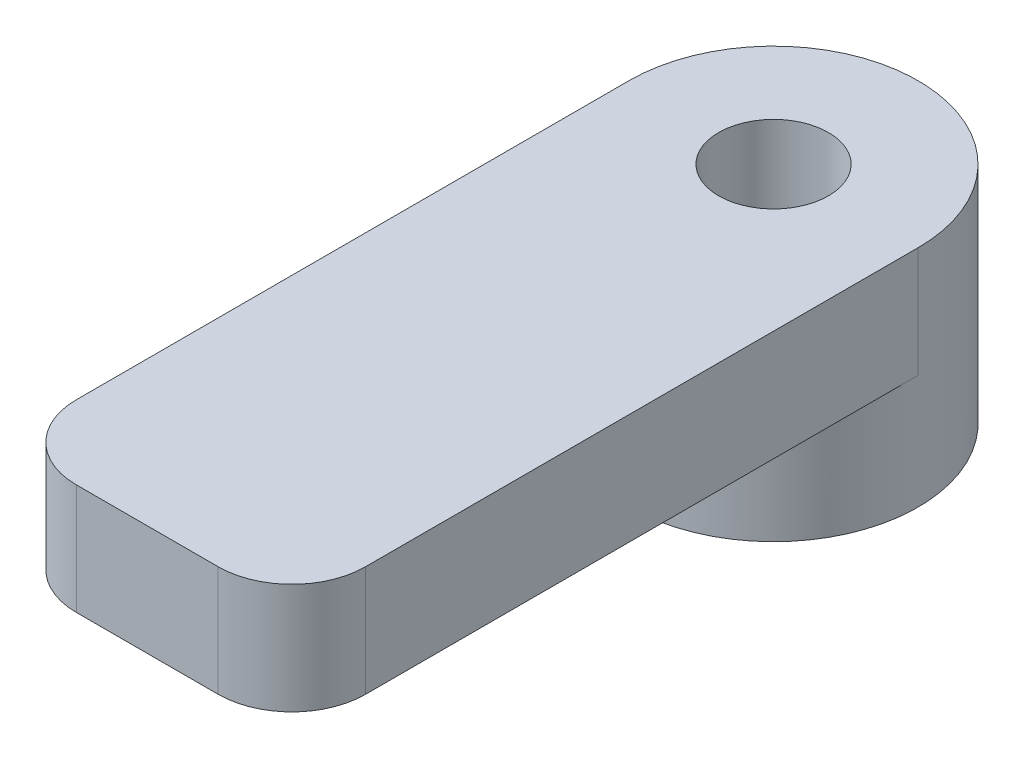
ISO-10303-21;
HEADER;
FILE_DESCRIPTION(('STEP AP214'),'2;1');
FILE_NAME('part.step','',(''),(''),'','','');
FILE_SCHEMA(('AUTOMOTIVE_DESIGN { 1 0 10303 214 1 1 1 1 }'));
ENDSEC;
DATA;
#1=APPLICATION_CONTEXT('core data for automotive mechanical design processes');
#2=APPLICATION_PROTOCOL_DEFINITION('international standard','automotive_design',2000,#1);
#3=PRODUCT_CONTEXT('',#1,'mechanical');
#4=PRODUCT('Part','Part','',(#3));
#5=PRODUCT_RELATED_PRODUCT_CATEGORY('part','',(#4));
#6=PRODUCT_DEFINITION_FORMATION('','',#4);
#7=PRODUCT_DEFINITION_CONTEXT('part definition',#1,'design');
#8=PRODUCT_DEFINITION('design','',#6,#7);
#9=PRODUCT_DEFINITION_SHAPE('','',#8);
#10=(LENGTH_UNIT() NAMED_UNIT(*) SI_UNIT(.MILLI.,.METRE.));
#11=(NAMED_UNIT(*) PLANE_ANGLE_UNIT() SI_UNIT($,.RADIAN.));
#12=(NAMED_UNIT(*) SI_UNIT($,.STERADIAN.) SOLID_ANGLE_UNIT());
#13=UNCERTAINTY_MEASURE_WITH_UNIT(LENGTH_MEASURE(1.E-05),#10,'distance_accuracy_value','');
#14=(GEOMETRIC_REPRESENTATION_CONTEXT(3) GLOBAL_UNCERTAINTY_ASSIGNED_CONTEXT((#13)) GLOBAL_UNIT_ASSIGNED_CONTEXT((#10,
#11,#12)) REPRESENTATION_CONTEXT('',''));
#15=CARTESIAN_POINT('',(0.,0.,0.));
#16=DIRECTION('',(0.,0.,1.));
#17=DIRECTION('',(1.,0.,0.));
#18=AXIS2_PLACEMENT_3D('',#15,#16,#17);
#19=CARTESIAN_POINT('',(0.,3.1,0.));
#20=DIRECTION('',(0.,-1.,0.));
#21=DIRECTION('',(0.,0.,-1.));
#22=AXIS2_PLACEMENT_3D('',#19,#20,#21);
#23=CYLINDRICAL_SURFACE('',#22,3.925);
#24=CARTESIAN_POINT('',(0.,3.1,0.));
#25=DIRECTION('',(0.,1.,0.));
#26=DIRECTION('',(0.,0.,1.));
#27=AXIS2_PLACEMENT_3D('',#24,#25,#26);
#28=CIRCLE('',#27,3.925);
#29=CARTESIAN_POINT('',(-3.925,3.1,0.));
#30=VERTEX_POINT('',#29);
#31=CARTESIAN_POINT('',(3.925,3.1,0.));
#32=VERTEX_POINT('',#31);
#33=EDGE_CURVE('E11',#30,#32,#28,.T.);
#34=ORIENTED_EDGE('',*,*,#33,.F.);
#35=DIRECTION('',(0.,-1.,0.));
#36=VECTOR('',#35,1.);
#37=CARTESIAN_POINT('',(-3.925,6.1,0.));
#38=LINE('',#37,#36);
#39=CARTESIAN_POINT('',(-3.925,6.1,0.));
#40=VERTEX_POINT('',#39);
#41=EDGE_CURVE('E143',#40,#30,#38,.T.);
#42=ORIENTED_EDGE('',*,*,#41,.F.);
#43=CARTESIAN_POINT('',(0.,6.1,0.));
#44=DIRECTION('',(0.,1.,0.));
#45=DIRECTION('',(0.,0.,-1.));
#46=AXIS2_PLACEMENT_3D('',#43,#44,#45);
#47=CIRCLE('',#46,3.925);
#48=CARTESIAN_POINT('',(3.925,6.1,0.));
#49=VERTEX_POINT('',#48);
#50=EDGE_CURVE('E136',#49,#40,#47,.T.);
#51=ORIENTED_EDGE('',*,*,#50,.F.);
#52=DIRECTION('',(0.,-1.,0.));
#53=VECTOR('',#52,1.);
#54=CARTESIAN_POINT('',(3.925,6.1,0.));
#55=LINE('',#54,#53);
#56=EDGE_CURVE('E122',#49,#32,#55,.T.);
#57=ORIENTED_EDGE('',*,*,#56,.T.);
#58=EDGE_LOOP('',(#34,#42,#51,#57));
#59=FACE_BOUND('',#58,.T.);
#60=CARTESIAN_POINT('',(0.,0.,0.));
#61=DIRECTION('',(0.,1.,0.));
#62=DIRECTION('',(0.,0.,1.));
#63=AXIS2_PLACEMENT_3D('',#60,#61,#62);
#64=CIRCLE('',#63,3.925);
#65=CARTESIAN_POINT('',(0.,0.,3.925));
#66=VERTEX_POINT('',#65);
#67=EDGE_CURVE('E42',#66,#66,#64,.T.);
#68=ORIENTED_EDGE('',*,*,#67,.T.);
#69=EDGE_LOOP('',(#68));
#70=FACE_BOUND('',#69,.T.);
#71=ADVANCED_FACE('F39',(#59,#70),#23,.T.);
#72=CARTESIAN_POINT('',(0.,0.,0.));
#73=DIRECTION('',(0.,1.,0.));
#74=DIRECTION('',(0.,0.,1.));
#75=AXIS2_PLACEMENT_3D('',#72,#73,#74);
#76=PLANE('',#75);
#77=CARTESIAN_POINT('',(0.,0.,0.));
#78=DIRECTION('',(0.,1.,0.));
#79=DIRECTION('',(0.,0.,1.));
#80=AXIS2_PLACEMENT_3D('',#77,#78,#79);
#81=CIRCLE('',#80,1.49);
#82=CARTESIAN_POINT('',(0.,0.,1.49));
#83=VERTEX_POINT('',#82);
#84=EDGE_CURVE('E145',#83,#83,#81,.T.);
#85=ORIENTED_EDGE('',*,*,#84,.T.);
#86=EDGE_LOOP('',(#85));
#87=FACE_BOUND('',#86,.T.);
#88=ORIENTED_EDGE('',*,*,#67,.F.);
#89=EDGE_LOOP('',(#88));
#90=FACE_BOUND('',#89,.T.);
#91=ADVANCED_FACE('F153',(#87,#90),#76,.F.);
#92=CARTESIAN_POINT('',(0.,0.,0.));
#93=DIRECTION('',(0.,1.,0.));
#94=DIRECTION('',(0.,0.,1.));
#95=AXIS2_PLACEMENT_3D('',#92,#93,#94);
#96=CYLINDRICAL_SURFACE('',#95,1.49);
#97=CARTESIAN_POINT('',(0.,6.1,0.));
#98=DIRECTION('',(0.,1.,0.));
#99=DIRECTION('',(0.,0.,1.));
#100=AXIS2_PLACEMENT_3D('',#97,#98,#99);
#101=CIRCLE('',#100,1.49);
#102=CARTESIAN_POINT('',(0.,6.1,1.49));
#103=VERTEX_POINT('',#102);
#104=EDGE_CURVE('E129',#103,#103,#101,.T.);
#105=CARTESIAN_POINT('',(0.,0.,1.49));
#106=CARTESIAN_POINT('',(0.,0.0635416666666666,1.49));
#107=CARTESIAN_POINT('',(0.,0.127083333333333,1.49));
#108=CARTESIAN_POINT('',(0.,0.254166666666667,1.49));
#109=CARTESIAN_POINT('',(0.,0.317708333333333,1.49));
#110=CARTESIAN_POINT('',(0.,0.444791666666667,1.49));
#111=CARTESIAN_POINT('',(0.,0.508333333333333,1.49));
#112=CARTESIAN_POINT('',(0.,0.635416666666667,1.49));
#113=CARTESIAN_POINT('',(0.,0.698958333333333,1.49));
#114=CARTESIAN_POINT('',(0.,0.826041666666667,1.49));
#115=CARTESIAN_POINT('',(0.,0.889583333333333,1.49));
#116=CARTESIAN_POINT('',(0.,1.01666666666667,1.49));
#117=CARTESIAN_POINT('',(0.,1.08020833333333,1.49));
#118=CARTESIAN_POINT('',(0.,1.20729166666667,1.49));
#119=CARTESIAN_POINT('',(0.,1.27083333333333,1.49));
#120=CARTESIAN_POINT('',(0.,1.39791666666667,1.49));
#121=CARTESIAN_POINT('',(0.,1.46145833333333,1.49));
#122=CARTESIAN_POINT('',(0.,1.58854166666667,1.49));
#123=CARTESIAN_POINT('',(0.,1.65208333333333,1.49));
#124=CARTESIAN_POINT('',(0.,1.77916666666667,1.49));
#125=CARTESIAN_POINT('',(0.,1.84270833333333,1.49));
#126=CARTESIAN_POINT('',(0.,1.96979166666667,1.49));
#127=CARTESIAN_POINT('',(0.,2.03333333333333,1.49));
#128=CARTESIAN_POINT('',(0.,2.16041666666667,1.49));
#129=CARTESIAN_POINT('',(0.,2.22395833333333,1.49));
#130=CARTESIAN_POINT('',(0.,2.35104166666667,1.49));
#131=CARTESIAN_POINT('',(0.,2.41458333333333,1.49));
#132=CARTESIAN_POINT('',(0.,2.54166666666667,1.49));
#133=CARTESIAN_POINT('',(0.,2.60520833333333,1.49));
#134=CARTESIAN_POINT('',(0.,2.73229166666667,1.49));
#135=CARTESIAN_POINT('',(0.,2.79583333333333,1.49));
#136=CARTESIAN_POINT('',(0.,2.92291666666667,1.49));
#137=CARTESIAN_POINT('',(0.,2.98645833333333,1.49));
#138=CARTESIAN_POINT('',(0.,3.11354166666667,1.49));
#139=CARTESIAN_POINT('',(0.,3.17708333333333,1.49));
#140=CARTESIAN_POINT('',(0.,3.30416666666667,1.49));
#141=CARTESIAN_POINT('',(0.,3.36770833333333,1.49));
#142=CARTESIAN_POINT('',(0.,3.49479166666667,1.49));
#143=CARTESIAN_POINT('',(0.,3.55833333333333,1.49));
#144=CARTESIAN_POINT('',(0.,3.68541666666667,1.49));
#145=CARTESIAN_POINT('',(0.,3.74895833333333,1.49));
#146=CARTESIAN_POINT('',(0.,3.87604166666667,1.49));
#147=CARTESIAN_POINT('',(0.,3.93958333333333,1.49));
#148=CARTESIAN_POINT('',(0.,4.06666666666667,1.49));
#149=CARTESIAN_POINT('',(0.,4.13020833333333,1.49));
#150=CARTESIAN_POINT('',(0.,4.25729166666667,1.49));
#151=CARTESIAN_POINT('',(0.,4.32083333333333,1.49));
#152=CARTESIAN_POINT('',(0.,4.44791666666667,1.49));
#153=CARTESIAN_POINT('',(0.,4.51145833333333,1.49));
#154=CARTESIAN_POINT('',(0.,4.63854166666667,1.49));
#155=CARTESIAN_POINT('',(0.,4.70208333333333,1.49));
#156=CARTESIAN_POINT('',(0.,4.82916666666667,1.49));
#157=CARTESIAN_POINT('',(0.,4.89270833333333,1.49));
#158=CARTESIAN_POINT('',(0.,5.01979166666667,1.49));
#159=CARTESIAN_POINT('',(0.,5.08333333333333,1.49));
#160=CARTESIAN_POINT('',(0.,5.21041666666667,1.49));
#161=CARTESIAN_POINT('',(0.,5.27395833333333,1.49));
#162=CARTESIAN_POINT('',(0.,5.40104166666667,1.49));
#163=CARTESIAN_POINT('',(0.,5.46458333333333,1.49));
#164=CARTESIAN_POINT('',(0.,5.59166666666667,1.49));
#165=CARTESIAN_POINT('',(0.,5.65520833333333,1.49));
#166=CARTESIAN_POINT('',(0.,5.78229166666667,1.49));
#167=CARTESIAN_POINT('',(0.,5.84583333333333,1.49));
#168=CARTESIAN_POINT('',(0.,5.97291666666667,1.49));
#169=CARTESIAN_POINT('',(0.,6.03645833333333,1.49));
#170=CARTESIAN_POINT('',(0.,6.1,1.49));
#171=B_SPLINE_CURVE_WITH_KNOTS('',3,(#105,#106,#107,#108,#109,#110,#111,#112,#113,#114,#115,
#116,#117,#118,#119,#120,#121,#122,#123,#124,#125,#126,#127,#128,#129,#130,#131,#132,#133,#134,
#135,#136,#137,#138,#139,#140,#141,#142,#143,#144,#145,#146,#147,#148,#149,#150,#151,#152,#153,
#154,#155,#156,#157,#158,#159,#160,#161,#162,#163,#164,#165,#166,#167,#168,#169,#170),
.UNSPECIFIED.,.F.,.F.,(4,2,2,2,2,2,2,2,2,2,2,2,2,2,2,2,2,2,2,2,2,2,2,2,2,2,2,2,2,2,2,2,4),(0.,
0.190625,0.38125,0.571875,0.7625,0.953125,1.14375,1.334375,1.525,1.715625,1.90625,2.096875,
2.2875,2.478125,2.66875,2.859375,3.05,3.240625,3.43125,3.621875,3.8125,4.003125,4.19375,
4.384375,4.575,4.765625,4.95625,5.146875,5.3375,5.528125,5.71875,5.909375,6.1),.UNSPECIFIED.);
#172=EDGE_CURVE('BSEAM155',#83,#103,#171,.T.);
#173=ORIENTED_EDGE('',*,*,#84,.F.);
#174=ORIENTED_EDGE('',*,*,#104,.T.);
#175=ORIENTED_EDGE('',*,*,#172,.T.);
#176=ORIENTED_EDGE('',*,*,#172,.F.);
#177=EDGE_LOOP('',(#173,#175,#174,#176));
#178=FACE_BOUND('',#177,.T.);
#179=ADVANCED_FACE('F155',(#178),#96,.F.);
#180=CARTESIAN_POINT('',(0.,6.1,0.));
#181=DIRECTION('',(0.,-1.,0.));
#182=DIRECTION('',(0.,0.,-1.));
#183=AXIS2_PLACEMENT_3D('',#180,#181,#182);
#184=PLANE('',#183);
#185=ORIENTED_EDGE('',*,*,#50,.T.);
#186=DIRECTION('',(0.,0.,1.));
#187=VECTOR('',#186,1.);
#188=CARTESIAN_POINT('',(-3.925,6.1,0.));
#189=LINE('',#188,#187);
#190=CARTESIAN_POINT('',(-3.925,6.1,15.));
#191=VERTEX_POINT('',#190);
#192=EDGE_CURVE('E89',#40,#191,#189,.T.);
#193=ORIENTED_EDGE('',*,*,#192,.T.);
#194=CARTESIAN_POINT('',(-1.925,6.1,15.));
#195=DIRECTION('',(0.,1.,0.));
#196=DIRECTION('',(0.,0.,1.));
#197=AXIS2_PLACEMENT_3D('',#194,#195,#196);
#198=CIRCLE('',#197,2.);
#199=CARTESIAN_POINT('',(-1.925,6.1,17.));
#200=VERTEX_POINT('',#199);
#201=EDGE_CURVE('E104',#191,#200,#198,.T.);
#202=ORIENTED_EDGE('',*,*,#201,.T.);
#203=DIRECTION('',(1.,0.,0.));
#204=VECTOR('',#203,1.);
#205=CARTESIAN_POINT('',(-1.925,6.1,17.));
#206=LINE('',#205,#204);
#207=CARTESIAN_POINT('',(1.925,6.1,17.));
#208=VERTEX_POINT('',#207);
#209=EDGE_CURVE('E96',#200,#208,#206,.T.);
#210=ORIENTED_EDGE('',*,*,#209,.T.);
#211=CARTESIAN_POINT('',(1.925,6.1,15.));
#212=DIRECTION('',(0.,1.,0.));
#213=DIRECTION('',(0.,0.,1.));
#214=AXIS2_PLACEMENT_3D('',#211,#212,#213);
#215=CIRCLE('',#214,2.);
#216=CARTESIAN_POINT('',(3.925,6.1,15.));
#217=VERTEX_POINT('',#216);
#218=EDGE_CURVE('E101',#208,#217,#215,.T.);
#219=ORIENTED_EDGE('',*,*,#218,.T.);
#220=DIRECTION('',(0.,0.,-1.));
#221=VECTOR('',#220,1.);
#222=CARTESIAN_POINT('',(3.925,6.1,15.));
#223=LINE('',#222,#221);
#224=EDGE_CURVE('E60',#217,#49,#223,.T.);
#225=ORIENTED_EDGE('',*,*,#224,.T.);
#226=EDGE_LOOP('',(#185,#193,#202,#210,#219,#225));
#227=FACE_BOUND('',#226,.T.);
#228=ORIENTED_EDGE('',*,*,#104,.F.);
#229=EDGE_LOOP('',(#228));
#230=FACE_BOUND('',#229,.T.);
#231=ADVANCED_FACE('F98',(#227,#230),#184,.F.);
#232=CARTESIAN_POINT('',(0.,3.1,0.));
#233=DIRECTION('',(0.,-1.,0.));
#234=DIRECTION('',(0.,0.,-1.));
#235=AXIS2_PLACEMENT_3D('',#232,#233,#234);
#236=PLANE('',#235);
#237=DIRECTION('',(0.,0.,1.));
#238=VECTOR('',#237,1.);
#239=CARTESIAN_POINT('',(-3.925,3.1,0.));
#240=LINE('',#239,#238);
#241=CARTESIAN_POINT('',(-3.925,3.1,15.));
#242=VERTEX_POINT('',#241);
#243=EDGE_CURVE('E126',#30,#242,#240,.T.);
#244=ORIENTED_EDGE('',*,*,#243,.F.);
#245=ORIENTED_EDGE('',*,*,#33,.T.);
#246=DIRECTION('',(0.,0.,-1.));
#247=VECTOR('',#246,1.);
#248=CARTESIAN_POINT('',(3.925,3.1,15.));
#249=LINE('',#248,#247);
#250=CARTESIAN_POINT('',(3.925,3.1,15.));
#251=VERTEX_POINT('',#250);
#252=EDGE_CURVE('E134',#251,#32,#249,.T.);
#253=ORIENTED_EDGE('',*,*,#252,.F.);
#254=CARTESIAN_POINT('',(1.925,3.1,15.));
#255=DIRECTION('',(0.,1.,0.));
#256=DIRECTION('',(0.,0.,1.));
#257=AXIS2_PLACEMENT_3D('',#254,#255,#256);
#258=CIRCLE('',#257,2.);
#259=CARTESIAN_POINT('',(1.925,3.1,17.));
#260=VERTEX_POINT('',#259);
#261=EDGE_CURVE('E132',#260,#251,#258,.T.);
#262=ORIENTED_EDGE('',*,*,#261,.F.);
#263=DIRECTION('',(1.,0.,0.));
#264=VECTOR('',#263,1.);
#265=CARTESIAN_POINT('',(-1.925,3.1,17.));
#266=LINE('',#265,#264);
#267=CARTESIAN_POINT('',(-1.925,3.1,17.));
#268=VERTEX_POINT('',#267);
#269=EDGE_CURVE('E113',#268,#260,#266,.T.);
#270=ORIENTED_EDGE('',*,*,#269,.F.);
#271=CARTESIAN_POINT('',(-1.925,3.1,15.));
#272=DIRECTION('',(0.,1.,0.));
#273=DIRECTION('',(0.,0.,1.));
#274=AXIS2_PLACEMENT_3D('',#271,#272,#273);
#275=CIRCLE('',#274,2.);
#276=EDGE_CURVE('E128',#242,#268,#275,.T.);
#277=ORIENTED_EDGE('',*,*,#276,.F.);
#278=EDGE_LOOP('',(#244,#245,#253,#262,#270,#277));
#279=FACE_BOUND('',#278,.T.);
#280=ADVANCED_FACE('F167',(#279),#236,.T.);
#281=CARTESIAN_POINT('',(-3.925,6.1,0.));
#282=DIRECTION('',(1.,0.,0.));
#283=DIRECTION('',(0.,0.,-1.));
#284=AXIS2_PLACEMENT_3D('',#281,#282,#283);
#285=PLANE('',#284);
#286=ORIENTED_EDGE('',*,*,#243,.T.);
#287=DIRECTION('',(0.,-1.,0.));
#288=VECTOR('',#287,1.);
#289=CARTESIAN_POINT('',(-3.925,6.1,15.));
#290=LINE('',#289,#288);
#291=EDGE_CURVE('E140',#191,#242,#290,.T.);
#292=ORIENTED_EDGE('',*,*,#291,.F.);
#293=ORIENTED_EDGE('',*,*,#192,.F.);
#294=ORIENTED_EDGE('',*,*,#41,.T.);
#295=EDGE_LOOP('',(#286,#292,#293,#294));
#296=FACE_BOUND('',#295,.T.);
#297=ADVANCED_FACE('F163',(#296),#285,.F.);
#298=CARTESIAN_POINT('',(-1.925,6.1,15.));
#299=DIRECTION('',(0.,-1.,0.));
#300=DIRECTION('',(0.,0.,-1.));
#301=AXIS2_PLACEMENT_3D('',#298,#299,#300);
#302=CYLINDRICAL_SURFACE('',#301,2.);
#303=ORIENTED_EDGE('',*,*,#276,.T.);
#304=DIRECTION('',(0.,-1.,0.));
#305=VECTOR('',#304,1.);
#306=CARTESIAN_POINT('',(-1.925,6.1,17.));
#307=LINE('',#306,#305);
#308=EDGE_CURVE('E116',#200,#268,#307,.T.);
#309=ORIENTED_EDGE('',*,*,#308,.F.);
#310=ORIENTED_EDGE('',*,*,#201,.F.);
#311=ORIENTED_EDGE('',*,*,#291,.T.);
#312=EDGE_LOOP('',(#303,#309,#310,#311));
#313=FACE_BOUND('',#312,.T.);
#314=ADVANCED_FACE('F166',(#313),#302,.T.);
#315=CARTESIAN_POINT('',(-1.925,6.1,17.));
#316=DIRECTION('',(0.,0.,-1.));
#317=DIRECTION('',(-1.,0.,0.));
#318=AXIS2_PLACEMENT_3D('',#315,#316,#317);
#319=PLANE('',#318);
#320=ORIENTED_EDGE('',*,*,#269,.T.);
#321=DIRECTION('',(0.,-1.,0.));
#322=VECTOR('',#321,1.);
#323=CARTESIAN_POINT('',(1.925,6.1,17.));
#324=LINE('',#323,#322);
#325=EDGE_CURVE('E110',#208,#260,#324,.T.);
#326=ORIENTED_EDGE('',*,*,#325,.F.);
#327=ORIENTED_EDGE('',*,*,#209,.F.);
#328=ORIENTED_EDGE('',*,*,#308,.T.);
#329=EDGE_LOOP('',(#320,#326,#327,#328));
#330=FACE_BOUND('',#329,.T.);
#331=ADVANCED_FACE('F111',(#330),#319,.F.);
#332=CARTESIAN_POINT('',(1.925,6.1,15.));
#333=DIRECTION('',(0.,-1.,0.));
#334=DIRECTION('',(0.,0.,-1.));
#335=AXIS2_PLACEMENT_3D('',#332,#333,#334);
#336=CYLINDRICAL_SURFACE('',#335,2.);
#337=ORIENTED_EDGE('',*,*,#261,.T.);
#338=DIRECTION('',(0.,-1.,0.));
#339=VECTOR('',#338,1.);
#340=CARTESIAN_POINT('',(3.925,6.1,15.));
#341=LINE('',#340,#339);
#342=EDGE_CURVE('E117',#217,#251,#341,.T.);
#343=ORIENTED_EDGE('',*,*,#342,.F.);
#344=ORIENTED_EDGE('',*,*,#218,.F.);
#345=ORIENTED_EDGE('',*,*,#325,.T.);
#346=EDGE_LOOP('',(#337,#343,#344,#345));
#347=FACE_BOUND('',#346,.T.);
#348=ADVANCED_FACE('F119',(#347),#336,.T.);
#349=CARTESIAN_POINT('',(3.925,6.1,15.));
#350=DIRECTION('',(-1.,0.,0.));
#351=DIRECTION('',(0.,0.,1.));
#352=AXIS2_PLACEMENT_3D('',#349,#350,#351);
#353=PLANE('',#352);
#354=ORIENTED_EDGE('',*,*,#252,.T.);
#355=ORIENTED_EDGE('',*,*,#56,.F.);
#356=ORIENTED_EDGE('',*,*,#224,.F.);
#357=ORIENTED_EDGE('',*,*,#342,.T.);
#358=EDGE_LOOP('',(#354,#355,#356,#357));
#359=FACE_BOUND('',#358,.T.);
#360=ADVANCED_FACE('F175',(#359),#353,.F.);
#361=CLOSED_SHELL('',(#71,#91,#179,#231,#280,#297,#314,#331,#348,#360));
#362=MANIFOLD_SOLID_BREP('B2',#361);
#363=ADVANCED_BREP_SHAPE_REPRESENTATION('',(#18,#362),#14);
#364=SHAPE_DEFINITION_REPRESENTATION(#9,#363);
ENDSEC;
END-ISO-10303-21;
